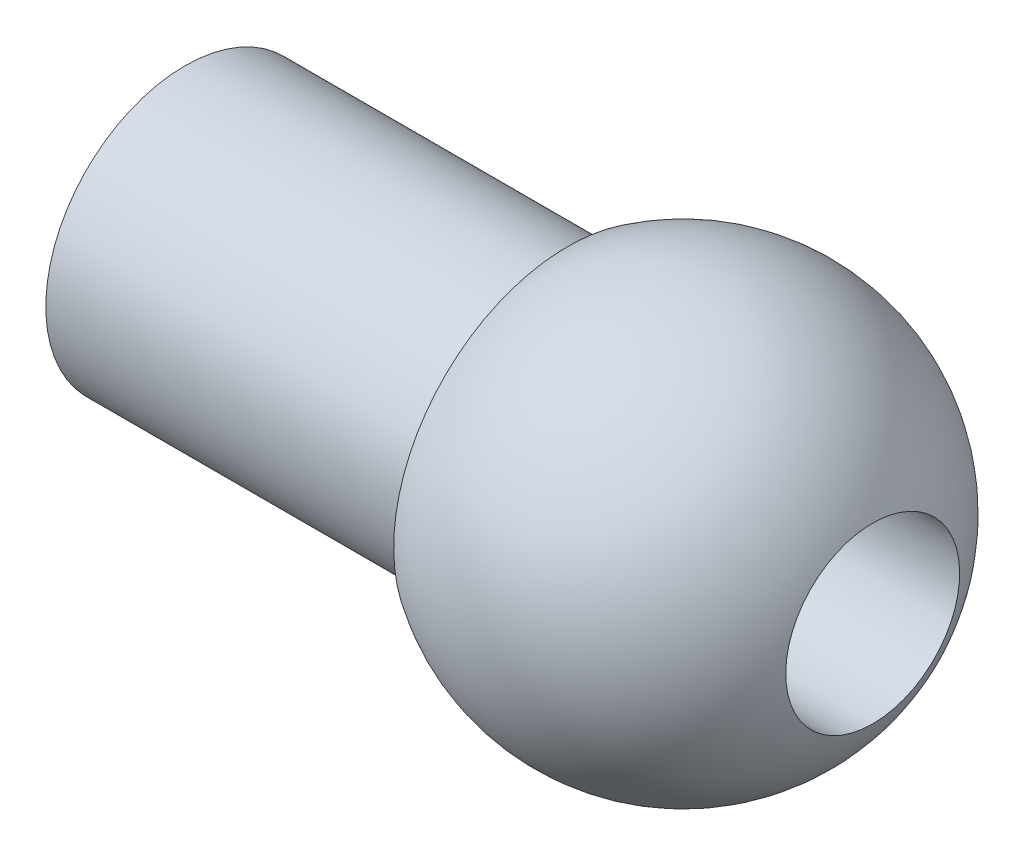
ISO-10303-21;
HEADER;
FILE_DESCRIPTION(('STEP AP214'),'2;1');
FILE_NAME('part.step','',(''),(''),'','','');
FILE_SCHEMA(('AUTOMOTIVE_DESIGN { 1 0 10303 214 1 1 1 1 }'));
ENDSEC;
DATA;
#1=APPLICATION_CONTEXT('core data for automotive mechanical design processes');
#2=APPLICATION_PROTOCOL_DEFINITION('international standard','automotive_design',2000,#1);
#3=PRODUCT_CONTEXT('',#1,'mechanical');
#4=PRODUCT('Part','Part','',(#3));
#5=PRODUCT_RELATED_PRODUCT_CATEGORY('part','',(#4));
#6=PRODUCT_DEFINITION_FORMATION('','',#4);
#7=PRODUCT_DEFINITION_CONTEXT('part definition',#1,'design');
#8=PRODUCT_DEFINITION('design','',#6,#7);
#9=PRODUCT_DEFINITION_SHAPE('','',#8);
#10=(LENGTH_UNIT() NAMED_UNIT(*) SI_UNIT(.MILLI.,.METRE.));
#11=(NAMED_UNIT(*) PLANE_ANGLE_UNIT() SI_UNIT($,.RADIAN.));
#12=(NAMED_UNIT(*) SI_UNIT($,.STERADIAN.) SOLID_ANGLE_UNIT());
#13=UNCERTAINTY_MEASURE_WITH_UNIT(LENGTH_MEASURE(1.E-05),#10,'distance_accuracy_value','');
#14=(GEOMETRIC_REPRESENTATION_CONTEXT(3) GLOBAL_UNCERTAINTY_ASSIGNED_CONTEXT((#13)) GLOBAL_UNIT_ASSIGNED_CONTEXT((#10,
#11,#12)) REPRESENTATION_CONTEXT('',''));
#15=CARTESIAN_POINT('',(0.,0.,0.));
#16=DIRECTION('',(0.,0.,1.));
#17=DIRECTION('',(1.,0.,0.));
#18=AXIS2_PLACEMENT_3D('',#15,#16,#17);
#19=CARTESIAN_POINT('',(14.3166247903554,0.,0.));
#20=DIRECTION('',(-1.,0.,0.));
#21=DIRECTION('',(0.,-1.,0.));
#22=AXIS2_PLACEMENT_3D('',#19,#20,#21);
#23=SPHERICAL_SURFACE('',#22,6.);
#24=CARTESIAN_POINT('',(19.7709808476732,0.,0.));
#25=DIRECTION('',(-1.,0.,0.));
#26=DIRECTION('',(0.,-1.,0.));
#27=AXIS2_PLACEMENT_3D('',#24,#25,#26);
#28=CIRCLE('',#27,2.5);
#29=CARTESIAN_POINT('',(19.7709808476733,-2.5,0.));
#30=VERTEX_POINT('',#29);
#31=EDGE_CURVE('E46',#30,#30,#28,.T.);
#32=CARTESIAN_POINT('',(11.,0.,0.));
#33=DIRECTION('',(-1.,0.,0.));
#34=DIRECTION('',(0.,-1.,0.));
#35=AXIS2_PLACEMENT_3D('',#32,#33,#34);
#36=CIRCLE('',#35,4.99999999999999);
#37=CARTESIAN_POINT('',(11.,-5.,0.));
#38=VERTEX_POINT('',#37);
#39=EDGE_CURVE('E10',#38,#38,#36,.T.);
#40=CARTESIAN_POINT('',(19.7709808476733,-2.5,0.));
#41=CARTESIAN_POINT('',(19.7260172314253,-2.59810632511746,0.));
#42=CARTESIAN_POINT('',(19.6784014549737,-2.69499672174875,0.));
#43=CARTESIAN_POINT('',(19.578016019997,-2.8860698331641,0.));
#44=CARTESIAN_POINT('',(19.5252463614719,-2.98025254794815,0.));
#45=CARTESIAN_POINT('',(19.4147036006827,-3.16563447079409,0.));
#46=CARTESIAN_POINT('',(19.3569304984185,-3.25683367885599,0.));
#47=CARTESIAN_POINT('',(19.236549873088,-3.4359835601013,0.));
#48=CARTESIAN_POINT('',(19.1739423500217,-3.52393423328471,0.));
#49=CARTESIAN_POINT('',(19.0440749015448,-3.69633090697972,0.));
#50=CARTESIAN_POINT('',(18.9768149761342,-3.78077690749132,0.));
#51=CARTESIAN_POINT('',(18.8378385728596,-3.9459184515349,0.));
#52=CARTESIAN_POINT('',(18.7661220949955,-4.02661399506687,0.));
#53=CARTESIAN_POINT('',(18.6184413320798,-4.18401971752981,0.));
#54=CARTESIAN_POINT('',(18.5424770470281,-4.26072989646077,0.));
#55=CARTESIAN_POINT('',(18.3865218007917,-4.40994159410215,0.));
#56=CARTESIAN_POINT('',(18.3065308396071,-4.48244311281256,0.));
#57=CARTESIAN_POINT('',(18.1427550879774,-4.62302644258927,0.));
#58=CARTESIAN_POINT('',(18.0589702975323,-4.69110825365558,0.));
#59=CARTESIAN_POINT('',(17.8878507793115,-4.82265398695936,0.));
#60=CARTESIAN_POINT('',(17.8005160515357,-4.88611790919684,0.));
#61=CARTESIAN_POINT('',(17.6225508838015,-5.00824312579748,0.));
#62=CARTESIAN_POINT('',(17.5319204438432,-5.06690442016064,0.));
#63=CARTESIAN_POINT('',(17.3476276705846,-5.17925362213426,0.));
#64=CARTESIAN_POINT('',(17.2539653372845,-5.23294152974471,0.));
#65=CARTESIAN_POINT('',(17.063881421782,-5.33518767649753,0.));
#66=CARTESIAN_POINT('',(16.9674598395798,-5.3837459156399,0.));
#67=CARTESIAN_POINT('',(16.7721381026996,-5.47559137584829,0.));
#68=CARTESIAN_POINT('',(16.6732379480216,-5.51887859691432,0.));
#69=CARTESIAN_POINT('',(16.4732469575639,-5.60005601492251,0.));
#70=CARTESIAN_POINT('',(16.3721561217842,-5.63794621186468,0.));
#71=CARTESIAN_POINT('',(16.1680780374157,-5.70821928593449,0.));
#72=CARTESIAN_POINT('',(16.0650907888269,-5.74060216306214,0.));
#73=CARTESIAN_POINT('',(15.8575196674567,-5.79976633323168,0.));
#74=CARTESIAN_POINT('',(15.7529357946753,-5.82654762627357,0.));
#75=CARTESIAN_POINT('',(15.5424758611967,-5.8744306698166,0.));
#76=CARTESIAN_POINT('',(15.4365998004996,-5.89553242031773,0.));
#77=CARTESIAN_POINT('',(15.2238636889344,-5.93199495307182,0.));
#78=CARTESIAN_POINT('',(15.1170036380663,-5.94735573532478,0.));
#79=CARTESIAN_POINT('',(14.9026106082298,-5.97229161742925,0.));
#80=CARTESIAN_POINT('',(14.7950776292614,-5.98186671728078,0.));
#81=CARTESIAN_POINT('',(14.5796517641421,-5.99520336214053,0.));
#82=CARTESIAN_POINT('',(14.4717588779911,-5.99896490714875,0.));
#83=CARTESIAN_POINT('',(14.2559272670848,-6.00066349273559,0.));
#84=CARTESIAN_POINT('',(14.1479885423293,-5.9986005333142,0.));
#85=CARTESIAN_POINT('',(13.9323794562412,-5.9886561151492,0.));
#86=CARTESIAN_POINT('',(13.8247090949085,-5.98077465640559,0.));
#87=CARTESIAN_POINT('',(13.609950156445,-5.95921618204865,0.));
#88=CARTESIAN_POINT('',(13.5028615793142,-5.94553916643533,0.));
#89=CARTESIAN_POINT('',(13.2895779367291,-5.9124293908606,0.));
#90=CARTESIAN_POINT('',(13.1833828712748,-5.8929966308992,0.));
#91=CARTESIAN_POINT('',(12.9721953777159,-5.84843193516431,0.));
#92=CARTESIAN_POINT('',(12.8672029496112,-5.82329999939083,0.));
#93=CARTESIAN_POINT('',(12.6587263588121,-5.76741010506053,0.));
#94=CARTESIAN_POINT('',(12.5552421961177,-5.73665214650371,0.));
#95=CARTESIAN_POINT('',(12.3500833618775,-5.66959975676669,0.));
#96=CARTESIAN_POINT('',(12.2484086903316,-5.63330532558649,0.));
#97=CARTESIAN_POINT('',(12.0471648411182,-5.5552855817471,0.));
#98=CARTESIAN_POINT('',(11.9475956634506,-5.51356026908791,0.));
#99=CARTESIAN_POINT('',(11.7508525104774,-5.42480044335955,0.));
#100=CARTESIAN_POINT('',(11.6536785351718,-5.37776593029038,0.));
#101=CARTESIAN_POINT('',(11.4620091400556,-5.27852379076911,0.));
#102=CARTESIAN_POINT('',(11.367513720245,-5.22631616431703,0.));
#103=CARTESIAN_POINT('',(11.18147468981,-5.11688285761282,0.));
#104=CARTESIAN_POINT('',(11.0899310791857,-5.0596571773607,0.));
#105=CARTESIAN_POINT('',(11.,-5.,0.));
#106=B_SPLINE_CURVE_WITH_KNOTS('',3,(#40,#41,#42,#43,#44,#45,#46,#47,#48,#49,#50,#51,#52,#53,
#54,#55,#56,#57,#58,#59,#60,#61,#62,#63,#64,#65,#66,#67,#68,#69,#70,#71,#72,#73,#74,#75,#76,#77,
#78,#79,#80,#81,#82,#83,#84,#85,#86,#87,#88,#89,#90,#91,#92,#93,#94,#95,#96,#97,#98,#99,#100,
#101,#102,#103,#104,#105),.UNSPECIFIED.,.F.,.F.,(4,2,2,2,2,2,2,2,2,2,2,2,2,2,2,2,2,2,2,2,2,2,2,
2,2,2,2,2,2,2,2,2,4),(0.,0.323718181072813,0.647436362145627,0.971154543218439,1.29487272429125,
1.61859090536406,1.94230908643687,2.26602726750969,2.5897454485825,2.91346362965531,
3.23718181072813,3.56089999180094,3.88461817287375,4.20833635394656,4.53205453501937,
4.85577271609218,5.179490897165,5.50320907823781,5.82692725931062,6.15064544038344,
6.47436362145625,6.79808180252906,7.12179998360187,7.44551816467469,7.7692363457475,
8.09295452682031,8.41667270789312,8.74039088896594,9.06410907003875,9.38782725111156,
9.71154543218437,10.0352636132572,10.35898179433),.UNSPECIFIED.);
#107=EDGE_CURVE('BSEAM32',#30,#38,#106,.T.);
#108=ORIENTED_EDGE('',*,*,#31,.T.);
#109=ORIENTED_EDGE('',*,*,#39,.F.);
#110=ORIENTED_EDGE('',*,*,#107,.T.);
#111=ORIENTED_EDGE('',*,*,#107,.F.);
#112=EDGE_LOOP('',(#108,#110,#109,#111));
#113=FACE_BOUND('',#112,.T.);
#114=ADVANCED_FACE('F32',(#113),#23,.T.);
#115=CARTESIAN_POINT('',(11.,4.,0.));
#116=DIRECTION('',(1.,0.,0.));
#117=DIRECTION('',(0.,1.,0.));
#118=AXIS2_PLACEMENT_3D('',#115,#116,#117);
#119=PLANE('',#118);
#120=CARTESIAN_POINT('',(11.,0.,0.));
#121=DIRECTION('',(-1.,0.,0.));
#122=DIRECTION('',(0.,-1.,0.));
#123=AXIS2_PLACEMENT_3D('',#120,#121,#122);
#124=CIRCLE('',#123,3.99999999999999);
#125=CARTESIAN_POINT('',(11.,-3.99999999999999,0.));
#126=VERTEX_POINT('',#125);
#127=EDGE_CURVE('E38',#126,#126,#124,.T.);
#128=ORIENTED_EDGE('',*,*,#127,.F.);
#129=EDGE_LOOP('',(#128));
#130=FACE_BOUND('',#129,.T.);
#131=ORIENTED_EDGE('',*,*,#39,.T.);
#132=EDGE_LOOP('',(#131));
#133=FACE_BOUND('',#132,.T.);
#134=ADVANCED_FACE('F66',(#130,#133),#119,.F.);
#135=CARTESIAN_POINT('',(-20.0169349071034,0.,0.));
#136=DIRECTION('',(-1.,0.,0.));
#137=DIRECTION('',(0.,-1.,0.));
#138=AXIS2_PLACEMENT_3D('',#135,#136,#137);
#139=CYLINDRICAL_SURFACE('',#138,3.99999999999999);
#140=CARTESIAN_POINT('',(0.,0.,0.));
#141=DIRECTION('',(-1.,0.,0.));
#142=DIRECTION('',(0.,-1.,0.));
#143=AXIS2_PLACEMENT_3D('',#140,#141,#142);
#144=CIRCLE('',#143,4.);
#145=CARTESIAN_POINT('',(0.,-3.99999999999999,0.));
#146=VERTEX_POINT('',#145);
#147=EDGE_CURVE('E42',#146,#146,#144,.T.);
#148=ORIENTED_EDGE('',*,*,#147,.F.);
#149=EDGE_LOOP('',(#148));
#150=FACE_BOUND('',#149,.T.);
#151=ORIENTED_EDGE('',*,*,#127,.T.);
#152=EDGE_LOOP('',(#151));
#153=FACE_BOUND('',#152,.T.);
#154=ADVANCED_FACE('F61',(#150,#153),#139,.T.);
#155=CARTESIAN_POINT('',(0.,0.,0.));
#156=DIRECTION('',(1.,0.,0.));
#157=DIRECTION('',(0.,1.,0.));
#158=AXIS2_PLACEMENT_3D('',#155,#156,#157);
#159=PLANE('',#158);
#160=CARTESIAN_POINT('',(0.,0.,0.));
#161=DIRECTION('',(-1.,0.,0.));
#162=DIRECTION('',(0.,-1.,0.));
#163=AXIS2_PLACEMENT_3D('',#160,#161,#162);
#164=CIRCLE('',#163,2.5);
#165=CARTESIAN_POINT('',(0.,-2.5,0.));
#166=VERTEX_POINT('',#165);
#167=EDGE_CURVE('E51',#166,#166,#164,.T.);
#168=ORIENTED_EDGE('',*,*,#167,.F.);
#169=EDGE_LOOP('',(#168));
#170=FACE_BOUND('',#169,.T.);
#171=ORIENTED_EDGE('',*,*,#147,.T.);
#172=EDGE_LOOP('',(#171));
#173=FACE_BOUND('',#172,.T.);
#174=ADVANCED_FACE('F58',(#170,#173),#159,.F.);
#175=CARTESIAN_POINT('',(20.3166247903554,0.,0.));
#176=DIRECTION('',(-1.,0.,0.));
#177=DIRECTION('',(0.,-1.,0.));
#178=AXIS2_PLACEMENT_3D('',#175,#176,#177);
#179=CYLINDRICAL_SURFACE('',#178,2.5);
#180=ORIENTED_EDGE('',*,*,#167,.T.);
#181=EDGE_LOOP('',(#180));
#182=FACE_BOUND('',#181,.T.);
#183=ORIENTED_EDGE('',*,*,#31,.F.);
#184=EDGE_LOOP('',(#183));
#185=FACE_BOUND('',#184,.T.);
#186=ADVANCED_FACE('F55',(#182,#185),#179,.F.);
#187=CLOSED_SHELL('',(#114,#134,#154,#174,#186));
#188=MANIFOLD_SOLID_BREP('B2',#187);
#189=ADVANCED_BREP_SHAPE_REPRESENTATION('',(#18,#188),#14);
#190=SHAPE_DEFINITION_REPRESENTATION(#9,#189);
ENDSEC;
END-ISO-10303-21;
